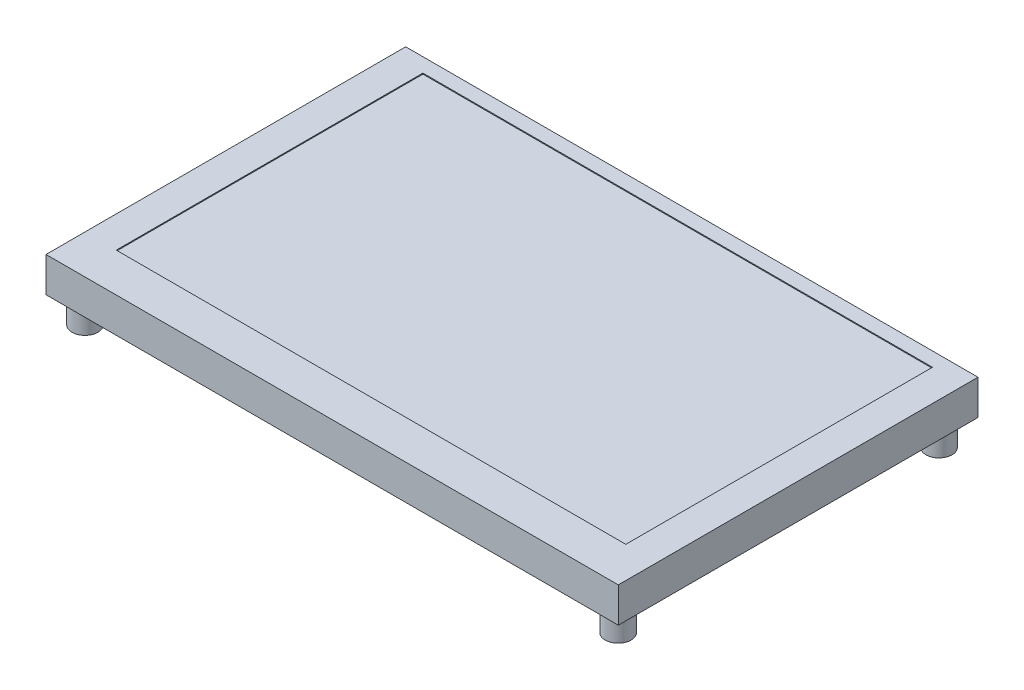
ISO-10303-21;
HEADER;
FILE_DESCRIPTION(('STEP AP214'),'2;1');
FILE_NAME('part.step','',(''),(''),'','','');
FILE_SCHEMA(('AUTOMOTIVE_DESIGN { 1 0 10303 214 1 1 1 1 }'));
ENDSEC;
DATA;
#1=APPLICATION_CONTEXT('core data for automotive mechanical design processes');
#2=APPLICATION_PROTOCOL_DEFINITION('international standard','automotive_design',2000,#1);
#3=PRODUCT_CONTEXT('',#1,'mechanical');
#4=PRODUCT('Part','Part','',(#3));
#5=PRODUCT_RELATED_PRODUCT_CATEGORY('part','',(#4));
#6=PRODUCT_DEFINITION_FORMATION('','',#4);
#7=PRODUCT_DEFINITION_CONTEXT('part definition',#1,'design');
#8=PRODUCT_DEFINITION('design','',#6,#7);
#9=PRODUCT_DEFINITION_SHAPE('','',#8);
#10=(LENGTH_UNIT() NAMED_UNIT(*) SI_UNIT(.MILLI.,.METRE.));
#11=(NAMED_UNIT(*) PLANE_ANGLE_UNIT() SI_UNIT($,.RADIAN.));
#12=(NAMED_UNIT(*) SI_UNIT($,.STERADIAN.) SOLID_ANGLE_UNIT());
#13=UNCERTAINTY_MEASURE_WITH_UNIT(LENGTH_MEASURE(1.E-05),#10,'distance_accuracy_value','');
#14=(GEOMETRIC_REPRESENTATION_CONTEXT(3) GLOBAL_UNCERTAINTY_ASSIGNED_CONTEXT((#13)) GLOBAL_UNIT_ASSIGNED_CONTEXT((#10,
#11,#12)) REPRESENTATION_CONTEXT('',''));
#15=CARTESIAN_POINT('',(0.,0.,0.));
#16=DIRECTION('',(0.,0.,1.));
#17=DIRECTION('',(1.,0.,0.));
#18=AXIS2_PLACEMENT_3D('',#15,#16,#17);
#19=CARTESIAN_POINT('',(0.,0.,0.));
#20=DIRECTION('',(0.,-1.,0.));
#21=DIRECTION('',(0.,0.,-1.));
#22=AXIS2_PLACEMENT_3D('',#19,#20,#21);
#23=PLANE('',#22);
#24=CARTESIAN_POINT('',(-29.35,0.,-24.38));
#25=DIRECTION('',(0.,-1.,0.));
#26=DIRECTION('',(0.,0.,-1.));
#27=AXIS2_PLACEMENT_3D('',#24,#25,#26);
#28=CIRCLE('',#27,2.75);
#29=CARTESIAN_POINT('',(-29.35,0.,-27.13));
#30=VERTEX_POINT('',#29);
#31=EDGE_CURVE('E194',#30,#30,#28,.T.);
#32=ORIENTED_EDGE('',*,*,#31,.F.);
#33=EDGE_LOOP('',(#32));
#34=FACE_BOUND('',#33,.T.);
#35=CARTESIAN_POINT('',(28.65,0.,-24.38));
#36=DIRECTION('',(0.,-1.,0.));
#37=DIRECTION('',(0.,0.,-1.));
#38=AXIS2_PLACEMENT_3D('',#35,#36,#37);
#39=CIRCLE('',#38,2.74999999999999);
#40=CARTESIAN_POINT('',(28.65,0.,-27.13));
#41=VERTEX_POINT('',#40);
#42=EDGE_CURVE('E203',#41,#41,#39,.T.);
#43=ORIENTED_EDGE('',*,*,#42,.F.);
#44=EDGE_LOOP('',(#43));
#45=FACE_BOUND('',#44,.T.);
#46=CARTESIAN_POINT('',(28.65,0.,24.62));
#47=DIRECTION('',(0.,-1.,0.));
#48=DIRECTION('',(0.,0.,-1.));
#49=AXIS2_PLACEMENT_3D('',#46,#47,#48);
#50=CIRCLE('',#49,2.75);
#51=CARTESIAN_POINT('',(28.65,0.,21.87));
#52=VERTEX_POINT('',#51);
#53=EDGE_CURVE('E212',#52,#52,#50,.T.);
#54=ORIENTED_EDGE('',*,*,#53,.F.);
#55=EDGE_LOOP('',(#54));
#56=FACE_BOUND('',#55,.T.);
#57=CARTESIAN_POINT('',(-29.35,0.,24.62));
#58=DIRECTION('',(0.,-1.,0.));
#59=DIRECTION('',(0.,0.,-1.));
#60=AXIS2_PLACEMENT_3D('',#57,#58,#59);
#61=CIRCLE('',#60,2.75);
#62=CARTESIAN_POINT('',(-29.35,0.,21.87));
#63=VERTEX_POINT('',#62);
#64=EDGE_CURVE('E221',#63,#63,#61,.T.);
#65=ORIENTED_EDGE('',*,*,#64,.F.);
#66=EDGE_LOOP('',(#65));
#67=FACE_BOUND('',#66,.T.);
#68=CARTESIAN_POINT('',(-56.5,0.,-34.));
#69=DIRECTION('',(0.,-1.,0.));
#70=DIRECTION('',(0.,0.,-1.));
#71=AXIS2_PLACEMENT_3D('',#68,#69,#70);
#72=CIRCLE('',#71,2.75);
#73=CARTESIAN_POINT('',(-56.5,0.,-36.75));
#74=VERTEX_POINT('',#73);
#75=EDGE_CURVE('E230',#74,#74,#72,.T.);
#76=ORIENTED_EDGE('',*,*,#75,.F.);
#77=EDGE_LOOP('',(#76));
#78=FACE_BOUND('',#77,.T.);
#79=CARTESIAN_POINT('',(56.5,0.,-34.));
#80=DIRECTION('',(0.,-1.,0.));
#81=DIRECTION('',(0.,0.,-1.));
#82=AXIS2_PLACEMENT_3D('',#79,#80,#81);
#83=CIRCLE('',#82,2.75);
#84=CARTESIAN_POINT('',(56.5,0.,-36.75));
#85=VERTEX_POINT('',#84);
#86=EDGE_CURVE('E239',#85,#85,#83,.T.);
#87=ORIENTED_EDGE('',*,*,#86,.F.);
#88=EDGE_LOOP('',(#87));
#89=FACE_BOUND('',#88,.T.);
#90=CARTESIAN_POINT('',(56.5,0.,34.));
#91=DIRECTION('',(0.,-1.,0.));
#92=DIRECTION('',(0.,0.,-1.));
#93=AXIS2_PLACEMENT_3D('',#90,#91,#92);
#94=CIRCLE('',#93,2.75);
#95=CARTESIAN_POINT('',(56.5,0.,31.25));
#96=VERTEX_POINT('',#95);
#97=EDGE_CURVE('E248',#96,#96,#94,.T.);
#98=ORIENTED_EDGE('',*,*,#97,.F.);
#99=EDGE_LOOP('',(#98));
#100=FACE_BOUND('',#99,.T.);
#101=CARTESIAN_POINT('',(-56.5,0.,34.));
#102=DIRECTION('',(0.,-1.,0.));
#103=DIRECTION('',(0.,0.,-1.));
#104=AXIS2_PLACEMENT_3D('',#101,#102,#103);
#105=CIRCLE('',#104,2.75);
#106=CARTESIAN_POINT('',(-56.5,0.,31.25));
#107=VERTEX_POINT('',#106);
#108=EDGE_CURVE('E257',#107,#107,#105,.T.);
#109=ORIENTED_EDGE('',*,*,#108,.F.);
#110=EDGE_LOOP('',(#109));
#111=FACE_BOUND('',#110,.T.);
#112=DIRECTION('',(-1.,0.,0.));
#113=VECTOR('',#112,1.);
#114=CARTESIAN_POINT('',(-60.65,0.,-38.12));
#115=LINE('',#114,#113);
#116=CARTESIAN_POINT('',(-43.65,0.,-38.12));
#117=VERTEX_POINT('',#116);
#118=CARTESIAN_POINT('',(-60.65,0.,-38.12));
#119=VERTEX_POINT('',#118);
#120=EDGE_CURVE('E277',#117,#119,#115,.T.);
#121=ORIENTED_EDGE('',*,*,#120,.F.);
#122=CARTESIAN_POINT('',(-43.65,0.,-30.12));
#123=DIRECTION('',(0.,-1.,0.));
#124=DIRECTION('',(0.,0.,-1.));
#125=AXIS2_PLACEMENT_3D('',#122,#123,#124);
#126=CIRCLE('',#125,8.);
#127=EDGE_CURVE('E57',#117,#117,#126,.T.);
#128=ORIENTED_EDGE('',*,*,#127,.F.);
#129=CARTESIAN_POINT('',(60.65,0.,-38.12));
#130=VERTEX_POINT('',#129);
#131=EDGE_CURVE('E278',#130,#117,#115,.T.);
#132=ORIENTED_EDGE('',*,*,#131,.F.);
#133=DIRECTION('',(0.,0.,-1.));
#134=VECTOR('',#133,1.);
#135=CARTESIAN_POINT('',(60.65,0.,38.12));
#136=LINE('',#135,#134);
#137=CARTESIAN_POINT('',(60.65,0.,38.12));
#138=VERTEX_POINT('',#137);
#139=EDGE_CURVE('E261',#138,#130,#136,.T.);
#140=ORIENTED_EDGE('',*,*,#139,.F.);
#141=DIRECTION('',(1.,0.,0.));
#142=VECTOR('',#141,1.);
#143=CARTESIAN_POINT('',(-60.65,0.,38.12));
#144=LINE('',#143,#142);
#145=CARTESIAN_POINT('',(-60.65,0.,38.12));
#146=VERTEX_POINT('',#145);
#147=EDGE_CURVE('E268',#146,#138,#144,.T.);
#148=ORIENTED_EDGE('',*,*,#147,.F.);
#149=DIRECTION('',(0.,0.,1.));
#150=VECTOR('',#149,1.);
#151=CARTESIAN_POINT('',(-60.65,0.,38.12));
#152=LINE('',#151,#150);
#153=EDGE_CURVE('E281',#119,#146,#152,.T.);
#154=ORIENTED_EDGE('',*,*,#153,.F.);
#155=EDGE_LOOP('',(#121,#128,#132,#140,#148,#154));
#156=FACE_BOUND('',#155,.T.);
#157=DIRECTION('',(-1.,0.,0.));
#158=VECTOR('',#157,1.);
#159=CARTESIAN_POINT('',(-47.65,0.,7.48));
#160=LINE('',#159,#158);
#161=CARTESIAN_POINT('',(-42.65,0.,7.48));
#162=VERTEX_POINT('',#161);
#163=CARTESIAN_POINT('',(-47.65,0.,7.48));
#164=VERTEX_POINT('',#163);
#165=EDGE_CURVE('E463',#162,#164,#160,.T.);
#166=ORIENTED_EDGE('',*,*,#165,.F.);
#167=DIRECTION('',(0.,0.,1.));
#168=VECTOR('',#167,1.);
#169=CARTESIAN_POINT('',(-42.65,0.,-14.52));
#170=LINE('',#169,#168);
#171=CARTESIAN_POINT('',(-42.65,0.,-14.52));
#172=VERTEX_POINT('',#171);
#173=EDGE_CURVE('E150',#172,#162,#170,.T.);
#174=ORIENTED_EDGE('',*,*,#173,.F.);
#175=DIRECTION('',(1.,0.,0.));
#176=VECTOR('',#175,1.);
#177=CARTESIAN_POINT('',(-47.65,0.,-14.52));
#178=LINE('',#177,#176);
#179=CARTESIAN_POINT('',(-47.65,0.,-14.52));
#180=VERTEX_POINT('',#179);
#181=EDGE_CURVE('E146',#180,#172,#178,.T.);
#182=ORIENTED_EDGE('',*,*,#181,.F.);
#183=DIRECTION('',(0.,0.,-1.));
#184=VECTOR('',#183,1.);
#185=CARTESIAN_POINT('',(-47.65,0.,-14.52));
#186=LINE('',#185,#184);
#187=EDGE_CURVE('E465',#164,#180,#186,.T.);
#188=ORIENTED_EDGE('',*,*,#187,.F.);
#189=EDGE_LOOP('',(#166,#174,#182,#188));
#190=FACE_BOUND('',#189,.T.);
#191=ADVANCED_FACE('F36',(#34,#45,#56,#67,#78,#89,#100,#111,#156,#190),#23,.T.);
#192=CARTESIAN_POINT('',(0.,7.4,0.));
#193=DIRECTION('',(0.,-1.,0.));
#194=DIRECTION('',(0.,0.,-1.));
#195=AXIS2_PLACEMENT_3D('',#192,#193,#194);
#196=PLANE('',#195);
#197=DIRECTION('',(0.,0.,-1.));
#198=VECTOR('',#197,1.);
#199=CARTESIAN_POINT('',(60.65,7.4,38.12));
#200=LINE('',#199,#198);
#201=CARTESIAN_POINT('',(60.65,7.4,38.12));
#202=VERTEX_POINT('',#201);
#203=CARTESIAN_POINT('',(60.65,7.4,-38.12));
#204=VERTEX_POINT('',#203);
#205=EDGE_CURVE('E264',#202,#204,#200,.T.);
#206=ORIENTED_EDGE('',*,*,#205,.T.);
#207=DIRECTION('',(-1.,0.,0.));
#208=VECTOR('',#207,1.);
#209=CARTESIAN_POINT('',(-60.65,7.4,-38.12));
#210=LINE('',#209,#208);
#211=CARTESIAN_POINT('',(-60.65,7.4,-38.12));
#212=VERTEX_POINT('',#211);
#213=EDGE_CURVE('E267',#204,#212,#210,.T.);
#214=ORIENTED_EDGE('',*,*,#213,.T.);
#215=DIRECTION('',(0.,0.,1.));
#216=VECTOR('',#215,1.);
#217=CARTESIAN_POINT('',(-60.65,7.4,38.12));
#218=LINE('',#217,#216);
#219=CARTESIAN_POINT('',(-60.65,7.4,38.12));
#220=VERTEX_POINT('',#219);
#221=EDGE_CURVE('E270',#212,#220,#218,.T.);
#222=ORIENTED_EDGE('',*,*,#221,.T.);
#223=DIRECTION('',(1.,0.,0.));
#224=VECTOR('',#223,1.);
#225=CARTESIAN_POINT('',(-60.65,7.4,38.12));
#226=LINE('',#225,#224);
#227=EDGE_CURVE('E272',#220,#202,#226,.T.);
#228=ORIENTED_EDGE('',*,*,#227,.T.);
#229=EDGE_LOOP('',(#206,#214,#222,#228));
#230=FACE_BOUND('',#229,.T.);
#231=DIRECTION('',(1.,0.,0.));
#232=VECTOR('',#231,1.);
#233=CARTESIAN_POINT('',(-54.,7.4,-35.12));
#234=LINE('',#233,#232);
#235=CARTESIAN_POINT('',(-54.,7.4,-35.12));
#236=VERTEX_POINT('',#235);
#237=CARTESIAN_POINT('',(54.,7.4,-35.12));
#238=VERTEX_POINT('',#237);
#239=EDGE_CURVE('E159',#236,#238,#234,.T.);
#240=ORIENTED_EDGE('',*,*,#239,.T.);
#241=DIRECTION('',(0.,0.,-1.));
#242=VECTOR('',#241,1.);
#243=CARTESIAN_POINT('',(54.,7.4,29.88));
#244=LINE('',#243,#242);
#245=CARTESIAN_POINT('',(54.,7.4,29.88));
#246=VERTEX_POINT('',#245);
#247=EDGE_CURVE('E175',#246,#238,#244,.T.);
#248=ORIENTED_EDGE('',*,*,#247,.F.);
#249=DIRECTION('',(1.,0.,0.));
#250=VECTOR('',#249,1.);
#251=CARTESIAN_POINT('',(-54.,7.4,29.88));
#252=LINE('',#251,#250);
#253=CARTESIAN_POINT('',(-54.,7.4,29.88));
#254=VERTEX_POINT('',#253);
#255=EDGE_CURVE('E178',#254,#246,#252,.T.);
#256=ORIENTED_EDGE('',*,*,#255,.F.);
#257=DIRECTION('',(0.,0.,-1.));
#258=VECTOR('',#257,1.);
#259=CARTESIAN_POINT('',(-54.,7.4,29.88));
#260=LINE('',#259,#258);
#261=EDGE_CURVE('E164',#254,#236,#260,.T.);
#262=ORIENTED_EDGE('',*,*,#261,.T.);
#263=EDGE_LOOP('',(#240,#248,#256,#262));
#264=FACE_BOUND('',#263,.T.);
#265=ADVANCED_FACE('F345',(#230,#264),#196,.F.);
#266=CARTESIAN_POINT('',(60.65,7.4,38.12));
#267=DIRECTION('',(-1.,0.,0.));
#268=DIRECTION('',(0.,0.,1.));
#269=AXIS2_PLACEMENT_3D('',#266,#267,#268);
#270=PLANE('',#269);
#271=ORIENTED_EDGE('',*,*,#139,.T.);
#272=DIRECTION('',(0.,-1.,0.));
#273=VECTOR('',#272,1.);
#274=CARTESIAN_POINT('',(60.65,7.4,-38.12));
#275=LINE('',#274,#273);
#276=EDGE_CURVE('E292',#204,#130,#275,.T.);
#277=ORIENTED_EDGE('',*,*,#276,.F.);
#278=ORIENTED_EDGE('',*,*,#205,.F.);
#279=DIRECTION('',(0.,-1.,0.));
#280=VECTOR('',#279,1.);
#281=CARTESIAN_POINT('',(60.65,7.4,38.12));
#282=LINE('',#281,#280);
#283=EDGE_CURVE('E274',#202,#138,#282,.T.);
#284=ORIENTED_EDGE('',*,*,#283,.T.);
#285=EDGE_LOOP('',(#271,#277,#278,#284));
#286=FACE_BOUND('',#285,.T.);
#287=ADVANCED_FACE('F38',(#286),#270,.F.);
#288=CARTESIAN_POINT('',(-60.65,7.4,-38.12));
#289=DIRECTION('',(0.,0.,1.));
#290=DIRECTION('',(1.,0.,0.));
#291=AXIS2_PLACEMENT_3D('',#288,#289,#290);
#292=PLANE('',#291);
#293=ORIENTED_EDGE('',*,*,#131,.T.);
#294=ORIENTED_EDGE('',*,*,#120,.T.);
#295=DIRECTION('',(0.,-1.,0.));
#296=VECTOR('',#295,1.);
#297=CARTESIAN_POINT('',(-60.65,7.4,-38.12));
#298=LINE('',#297,#296);
#299=EDGE_CURVE('E289',#212,#119,#298,.T.);
#300=ORIENTED_EDGE('',*,*,#299,.F.);
#301=ORIENTED_EDGE('',*,*,#213,.F.);
#302=ORIENTED_EDGE('',*,*,#276,.T.);
#303=EDGE_LOOP('',(#293,#294,#300,#301,#302));
#304=FACE_BOUND('',#303,.T.);
#305=ADVANCED_FACE('F698',(#304),#292,.F.);
#306=CARTESIAN_POINT('',(-60.65,7.4,38.12));
#307=DIRECTION('',(1.,0.,0.));
#308=DIRECTION('',(0.,0.,-1.));
#309=AXIS2_PLACEMENT_3D('',#306,#307,#308);
#310=PLANE('',#309);
#311=ORIENTED_EDGE('',*,*,#153,.T.);
#312=DIRECTION('',(0.,-1.,0.));
#313=VECTOR('',#312,1.);
#314=CARTESIAN_POINT('',(-60.65,7.4,38.12));
#315=LINE('',#314,#313);
#316=EDGE_CURVE('E286',#220,#146,#315,.T.);
#317=ORIENTED_EDGE('',*,*,#316,.F.);
#318=ORIENTED_EDGE('',*,*,#221,.F.);
#319=ORIENTED_EDGE('',*,*,#299,.T.);
#320=EDGE_LOOP('',(#311,#317,#318,#319));
#321=FACE_BOUND('',#320,.T.);
#322=ADVANCED_FACE('F687',(#321),#310,.F.);
#323=CARTESIAN_POINT('',(-60.65,7.4,38.12));
#324=DIRECTION('',(0.,0.,-1.));
#325=DIRECTION('',(-1.,0.,0.));
#326=AXIS2_PLACEMENT_3D('',#323,#324,#325);
#327=PLANE('',#326);
#328=ORIENTED_EDGE('',*,*,#147,.T.);
#329=ORIENTED_EDGE('',*,*,#283,.F.);
#330=ORIENTED_EDGE('',*,*,#227,.F.);
#331=ORIENTED_EDGE('',*,*,#316,.T.);
#332=EDGE_LOOP('',(#328,#329,#330,#331));
#333=FACE_BOUND('',#332,.T.);
#334=ADVANCED_FACE('F448',(#333),#327,.F.);
#335=CARTESIAN_POINT('',(-56.5,-5.5,34.));
#336=DIRECTION('',(0.,-1.,0.));
#337=DIRECTION('',(0.,0.,-1.));
#338=AXIS2_PLACEMENT_3D('',#335,#336,#337);
#339=PLANE('',#338);
#340=CARTESIAN_POINT('',(-56.5,-5.5,34.));
#341=DIRECTION('',(0.,-1.,0.));
#342=DIRECTION('',(0.,0.,-1.));
#343=AXIS2_PLACEMENT_3D('',#340,#341,#342);
#344=CIRCLE('',#343,2.75);
#345=CARTESIAN_POINT('',(-56.5,-5.5,31.25));
#346=VERTEX_POINT('',#345);
#347=EDGE_CURVE('E258',#346,#346,#344,.T.);
#348=ORIENTED_EDGE('',*,*,#347,.T.);
#349=EDGE_LOOP('',(#348));
#350=FACE_BOUND('',#349,.T.);
#351=CARTESIAN_POINT('',(-56.5,-5.5,34.));
#352=DIRECTION('',(0.,-1.,0.));
#353=DIRECTION('',(0.,0.,-1.));
#354=AXIS2_PLACEMENT_3D('',#351,#352,#353);
#355=CIRCLE('',#354,1.5);
#356=CARTESIAN_POINT('',(-56.5,-5.5,32.5));
#357=VERTEX_POINT('',#356);
#358=EDGE_CURVE('E252',#357,#357,#355,.T.);
#359=ORIENTED_EDGE('',*,*,#358,.F.);
#360=EDGE_LOOP('',(#359));
#361=FACE_BOUND('',#360,.T.);
#362=ADVANCED_FACE('F445',(#350,#361),#339,.T.);
#363=CARTESIAN_POINT('',(-56.5,-5.5,34.));
#364=DIRECTION('',(0.,1.,0.));
#365=DIRECTION('',(0.,0.,1.));
#366=AXIS2_PLACEMENT_3D('',#363,#364,#365);
#367=CYLINDRICAL_SURFACE('',#366,2.75);
#368=ORIENTED_EDGE('',*,*,#347,.F.);
#369=EDGE_LOOP('',(#368));
#370=FACE_BOUND('',#369,.T.);
#371=ORIENTED_EDGE('',*,*,#108,.T.);
#372=EDGE_LOOP('',(#371));
#373=FACE_BOUND('',#372,.T.);
#374=ADVANCED_FACE('F366',(#370,#373),#367,.T.);
#375=CARTESIAN_POINT('',(-56.5,-5.5,34.));
#376=DIRECTION('',(0.,1.,0.));
#377=DIRECTION('',(0.,0.,1.));
#378=AXIS2_PLACEMENT_3D('',#375,#376,#377);
#379=CYLINDRICAL_SURFACE('',#378,1.5);
#380=ORIENTED_EDGE('',*,*,#358,.T.);
#381=EDGE_LOOP('',(#380));
#382=FACE_BOUND('',#381,.T.);
#383=CARTESIAN_POINT('',(-56.5,0.,34.));
#384=DIRECTION('',(0.,-1.,0.));
#385=DIRECTION('',(0.,0.,-1.));
#386=AXIS2_PLACEMENT_3D('',#383,#384,#385);
#387=CIRCLE('',#386,1.5);
#388=CARTESIAN_POINT('',(-56.5,0.,32.5));
#389=VERTEX_POINT('',#388);
#390=EDGE_CURVE('E295',#389,#389,#387,.F.);
#391=ORIENTED_EDGE('',*,*,#390,.T.);
#392=EDGE_LOOP('',(#391));
#393=FACE_BOUND('',#392,.T.);
#394=ADVANCED_FACE('F356',(#382,#393),#379,.F.);
#395=ORIENTED_EDGE('',*,*,#390,.F.);
#396=EDGE_LOOP('',(#395));
#397=FACE_BOUND('',#396,.T.);
#398=ADVANCED_FACE('F347',(#397),#23,.T.);
#399=CARTESIAN_POINT('',(56.5,-5.5,34.));
#400=DIRECTION('',(0.,-1.,0.));
#401=DIRECTION('',(0.,0.,-1.));
#402=AXIS2_PLACEMENT_3D('',#399,#400,#401);
#403=PLANE('',#402);
#404=CARTESIAN_POINT('',(56.5,-5.5,34.));
#405=DIRECTION('',(0.,-1.,0.));
#406=DIRECTION('',(0.,0.,-1.));
#407=AXIS2_PLACEMENT_3D('',#404,#405,#406);
#408=CIRCLE('',#407,2.75);
#409=CARTESIAN_POINT('',(56.5,-5.5,31.25));
#410=VERTEX_POINT('',#409);
#411=EDGE_CURVE('E249',#410,#410,#408,.T.);
#412=ORIENTED_EDGE('',*,*,#411,.T.);
#413=EDGE_LOOP('',(#412));
#414=FACE_BOUND('',#413,.T.);
#415=CARTESIAN_POINT('',(56.5,-5.5,34.));
#416=DIRECTION('',(0.,-1.,0.));
#417=DIRECTION('',(0.,0.,-1.));
#418=AXIS2_PLACEMENT_3D('',#415,#416,#417);
#419=CIRCLE('',#418,1.5);
#420=CARTESIAN_POINT('',(56.5,-5.5,32.5));
#421=VERTEX_POINT('',#420);
#422=EDGE_CURVE('E243',#421,#421,#419,.T.);
#423=ORIENTED_EDGE('',*,*,#422,.F.);
#424=EDGE_LOOP('',(#423));
#425=FACE_BOUND('',#424,.T.);
#426=ADVANCED_FACE('F355',(#414,#425),#403,.T.);
#427=CARTESIAN_POINT('',(56.5,-5.5,34.));
#428=DIRECTION('',(0.,1.,0.));
#429=DIRECTION('',(0.,0.,1.));
#430=AXIS2_PLACEMENT_3D('',#427,#428,#429);
#431=CYLINDRICAL_SURFACE('',#430,2.75);
#432=ORIENTED_EDGE('',*,*,#411,.F.);
#433=EDGE_LOOP('',(#432));
#434=FACE_BOUND('',#433,.T.);
#435=ORIENTED_EDGE('',*,*,#97,.T.);
#436=EDGE_LOOP('',(#435));
#437=FACE_BOUND('',#436,.T.);
#438=ADVANCED_FACE('F363',(#434,#437),#431,.T.);
#439=CARTESIAN_POINT('',(56.5,-5.5,34.));
#440=DIRECTION('',(0.,1.,0.));
#441=DIRECTION('',(0.,0.,1.));
#442=AXIS2_PLACEMENT_3D('',#439,#440,#441);
#443=CYLINDRICAL_SURFACE('',#442,1.5);
#444=ORIENTED_EDGE('',*,*,#422,.T.);
#445=EDGE_LOOP('',(#444));
#446=FACE_BOUND('',#445,.T.);
#447=CARTESIAN_POINT('',(56.5,0.,34.));
#448=DIRECTION('',(0.,-1.,0.));
#449=DIRECTION('',(0.,0.,-1.));
#450=AXIS2_PLACEMENT_3D('',#447,#448,#449);
#451=CIRCLE('',#450,1.5);
#452=CARTESIAN_POINT('',(56.5,0.,32.5));
#453=VERTEX_POINT('',#452);
#454=EDGE_CURVE('E298',#453,#453,#451,.F.);
#455=ORIENTED_EDGE('',*,*,#454,.T.);
#456=EDGE_LOOP('',(#455));
#457=FACE_BOUND('',#456,.T.);
#458=ADVANCED_FACE('F372',(#446,#457),#443,.F.);
#459=ORIENTED_EDGE('',*,*,#454,.F.);
#460=EDGE_LOOP('',(#459));
#461=FACE_BOUND('',#460,.T.);
#462=ADVANCED_FACE('F358',(#461),#23,.T.);
#463=CARTESIAN_POINT('',(56.5,-5.5,-34.));
#464=DIRECTION('',(0.,-1.,0.));
#465=DIRECTION('',(0.,0.,-1.));
#466=AXIS2_PLACEMENT_3D('',#463,#464,#465);
#467=PLANE('',#466);
#468=CARTESIAN_POINT('',(56.5,-5.5,-34.));
#469=DIRECTION('',(0.,-1.,0.));
#470=DIRECTION('',(0.,0.,-1.));
#471=AXIS2_PLACEMENT_3D('',#468,#469,#470);
#472=CIRCLE('',#471,2.75);
#473=CARTESIAN_POINT('',(56.5,-5.5,-36.75));
#474=VERTEX_POINT('',#473);
#475=EDGE_CURVE('E240',#474,#474,#472,.T.);
#476=ORIENTED_EDGE('',*,*,#475,.T.);
#477=EDGE_LOOP('',(#476));
#478=FACE_BOUND('',#477,.T.);
#479=CARTESIAN_POINT('',(56.5,-5.5,-34.));
#480=DIRECTION('',(0.,-1.,0.));
#481=DIRECTION('',(0.,0.,-1.));
#482=AXIS2_PLACEMENT_3D('',#479,#480,#481);
#483=CIRCLE('',#482,1.5);
#484=CARTESIAN_POINT('',(56.5,-5.5,-35.5));
#485=VERTEX_POINT('',#484);
#486=EDGE_CURVE('E234',#485,#485,#483,.T.);
#487=ORIENTED_EDGE('',*,*,#486,.F.);
#488=EDGE_LOOP('',(#487));
#489=FACE_BOUND('',#488,.T.);
#490=ADVANCED_FACE('F371',(#478,#489),#467,.T.);
#491=CARTESIAN_POINT('',(56.5,-5.5,-34.));
#492=DIRECTION('',(0.,1.,0.));
#493=DIRECTION('',(0.,0.,1.));
#494=AXIS2_PLACEMENT_3D('',#491,#492,#493);
#495=CYLINDRICAL_SURFACE('',#494,2.75);
#496=ORIENTED_EDGE('',*,*,#475,.F.);
#497=EDGE_LOOP('',(#496));
#498=FACE_BOUND('',#497,.T.);
#499=ORIENTED_EDGE('',*,*,#86,.T.);
#500=EDGE_LOOP('',(#499));
#501=FACE_BOUND('',#500,.T.);
#502=ADVANCED_FACE('F379',(#498,#501),#495,.T.);
#503=CARTESIAN_POINT('',(56.5,-5.5,-34.));
#504=DIRECTION('',(0.,1.,0.));
#505=DIRECTION('',(0.,0.,1.));
#506=AXIS2_PLACEMENT_3D('',#503,#504,#505);
#507=CYLINDRICAL_SURFACE('',#506,1.5);
#508=ORIENTED_EDGE('',*,*,#486,.T.);
#509=EDGE_LOOP('',(#508));
#510=FACE_BOUND('',#509,.T.);
#511=CARTESIAN_POINT('',(56.5,0.,-34.));
#512=DIRECTION('',(0.,-1.,0.));
#513=DIRECTION('',(0.,0.,-1.));
#514=AXIS2_PLACEMENT_3D('',#511,#512,#513);
#515=CIRCLE('',#514,1.5);
#516=CARTESIAN_POINT('',(56.5,0.,-35.5));
#517=VERTEX_POINT('',#516);
#518=EDGE_CURVE('E301',#517,#517,#515,.F.);
#519=ORIENTED_EDGE('',*,*,#518,.T.);
#520=EDGE_LOOP('',(#519));
#521=FACE_BOUND('',#520,.T.);
#522=ADVANCED_FACE('F387',(#510,#521),#507,.F.);
#523=ORIENTED_EDGE('',*,*,#518,.F.);
#524=EDGE_LOOP('',(#523));
#525=FACE_BOUND('',#524,.T.);
#526=ADVANCED_FACE('F374',(#525),#23,.T.);
#527=CARTESIAN_POINT('',(-56.5,-5.5,-34.));
#528=DIRECTION('',(0.,-1.,0.));
#529=DIRECTION('',(0.,0.,-1.));
#530=AXIS2_PLACEMENT_3D('',#527,#528,#529);
#531=PLANE('',#530);
#532=CARTESIAN_POINT('',(-56.5,-5.5,-34.));
#533=DIRECTION('',(0.,-1.,0.));
#534=DIRECTION('',(0.,0.,-1.));
#535=AXIS2_PLACEMENT_3D('',#532,#533,#534);
#536=CIRCLE('',#535,2.75);
#537=CARTESIAN_POINT('',(-56.5,-5.5,-36.75));
#538=VERTEX_POINT('',#537);
#539=EDGE_CURVE('E231',#538,#538,#536,.T.);
#540=ORIENTED_EDGE('',*,*,#539,.T.);
#541=EDGE_LOOP('',(#540));
#542=FACE_BOUND('',#541,.T.);
#543=CARTESIAN_POINT('',(-56.5,-5.5,-34.));
#544=DIRECTION('',(0.,-1.,0.));
#545=DIRECTION('',(0.,0.,-1.));
#546=AXIS2_PLACEMENT_3D('',#543,#544,#545);
#547=CIRCLE('',#546,1.5);
#548=CARTESIAN_POINT('',(-56.5,-5.5,-35.5));
#549=VERTEX_POINT('',#548);
#550=EDGE_CURVE('E225',#549,#549,#547,.T.);
#551=ORIENTED_EDGE('',*,*,#550,.F.);
#552=EDGE_LOOP('',(#551));
#553=FACE_BOUND('',#552,.T.);
#554=ADVANCED_FACE('F386',(#542,#553),#531,.T.);
#555=CARTESIAN_POINT('',(-56.5,-5.5,-34.));
#556=DIRECTION('',(0.,1.,0.));
#557=DIRECTION('',(0.,0.,1.));
#558=AXIS2_PLACEMENT_3D('',#555,#556,#557);
#559=CYLINDRICAL_SURFACE('',#558,2.75);
#560=ORIENTED_EDGE('',*,*,#539,.F.);
#561=EDGE_LOOP('',(#560));
#562=FACE_BOUND('',#561,.T.);
#563=ORIENTED_EDGE('',*,*,#75,.T.);
#564=EDGE_LOOP('',(#563));
#565=FACE_BOUND('',#564,.T.);
#566=ADVANCED_FACE('F394',(#562,#565),#559,.T.);
#567=CARTESIAN_POINT('',(-56.5,-5.5,-34.));
#568=DIRECTION('',(0.,1.,0.));
#569=DIRECTION('',(0.,0.,1.));
#570=AXIS2_PLACEMENT_3D('',#567,#568,#569);
#571=CYLINDRICAL_SURFACE('',#570,1.5);
#572=ORIENTED_EDGE('',*,*,#550,.T.);
#573=EDGE_LOOP('',(#572));
#574=FACE_BOUND('',#573,.T.);
#575=CARTESIAN_POINT('',(-56.5,0.,-34.));
#576=DIRECTION('',(0.,-1.,0.));
#577=DIRECTION('',(0.,0.,-1.));
#578=AXIS2_PLACEMENT_3D('',#575,#576,#577);
#579=CIRCLE('',#578,1.5);
#580=CARTESIAN_POINT('',(-56.5,0.,-35.5));
#581=VERTEX_POINT('',#580);
#582=EDGE_CURVE('E304',#581,#581,#579,.F.);
#583=ORIENTED_EDGE('',*,*,#582,.T.);
#584=EDGE_LOOP('',(#583));
#585=FACE_BOUND('',#584,.T.);
#586=ADVANCED_FACE('F402',(#574,#585),#571,.F.);
#587=ORIENTED_EDGE('',*,*,#582,.F.);
#588=EDGE_LOOP('',(#587));
#589=FACE_BOUND('',#588,.T.);
#590=ADVANCED_FACE('F389',(#589),#23,.T.);
#591=CARTESIAN_POINT('',(-29.35,-5.3,24.62));
#592=DIRECTION('',(0.,-1.,0.));
#593=DIRECTION('',(0.,0.,-1.));
#594=AXIS2_PLACEMENT_3D('',#591,#592,#593);
#595=PLANE('',#594);
#596=CARTESIAN_POINT('',(-29.35,-5.3,24.62));
#597=DIRECTION('',(0.,-1.,0.));
#598=DIRECTION('',(0.,0.,-1.));
#599=AXIS2_PLACEMENT_3D('',#596,#597,#598);
#600=CIRCLE('',#599,2.75);
#601=CARTESIAN_POINT('',(-29.35,-5.3,21.87));
#602=VERTEX_POINT('',#601);
#603=EDGE_CURVE('E222',#602,#602,#600,.T.);
#604=ORIENTED_EDGE('',*,*,#603,.T.);
#605=EDGE_LOOP('',(#604));
#606=FACE_BOUND('',#605,.T.);
#607=CARTESIAN_POINT('',(-29.35,-5.3,24.62));
#608=DIRECTION('',(0.,-1.,0.));
#609=DIRECTION('',(0.,0.,-1.));
#610=AXIS2_PLACEMENT_3D('',#607,#608,#609);
#611=CIRCLE('',#610,1.5);
#612=CARTESIAN_POINT('',(-29.35,-5.3,23.12));
#613=VERTEX_POINT('',#612);
#614=EDGE_CURVE('E216',#613,#613,#611,.T.);
#615=ORIENTED_EDGE('',*,*,#614,.F.);
#616=EDGE_LOOP('',(#615));
#617=FACE_BOUND('',#616,.T.);
#618=ADVANCED_FACE('F401',(#606,#617),#595,.T.);
#619=CARTESIAN_POINT('',(-29.35,-5.3,24.62));
#620=DIRECTION('',(0.,1.,0.));
#621=DIRECTION('',(0.,0.,1.));
#622=AXIS2_PLACEMENT_3D('',#619,#620,#621);
#623=CYLINDRICAL_SURFACE('',#622,2.75);
#624=ORIENTED_EDGE('',*,*,#603,.F.);
#625=EDGE_LOOP('',(#624));
#626=FACE_BOUND('',#625,.T.);
#627=ORIENTED_EDGE('',*,*,#64,.T.);
#628=EDGE_LOOP('',(#627));
#629=FACE_BOUND('',#628,.T.);
#630=ADVANCED_FACE('F408',(#626,#629),#623,.T.);
#631=CARTESIAN_POINT('',(-29.35,-5.3,24.62));
#632=DIRECTION('',(0.,1.,0.));
#633=DIRECTION('',(0.,0.,1.));
#634=AXIS2_PLACEMENT_3D('',#631,#632,#633);
#635=CYLINDRICAL_SURFACE('',#634,1.5);
#636=ORIENTED_EDGE('',*,*,#614,.T.);
#637=EDGE_LOOP('',(#636));
#638=FACE_BOUND('',#637,.T.);
#639=CARTESIAN_POINT('',(-29.35,0.,24.62));
#640=DIRECTION('',(0.,-1.,0.));
#641=DIRECTION('',(0.,0.,-1.));
#642=AXIS2_PLACEMENT_3D('',#639,#640,#641);
#643=CIRCLE('',#642,1.5);
#644=CARTESIAN_POINT('',(-29.35,0.,23.12));
#645=VERTEX_POINT('',#644);
#646=EDGE_CURVE('E307',#645,#645,#643,.F.);
#647=ORIENTED_EDGE('',*,*,#646,.T.);
#648=EDGE_LOOP('',(#647));
#649=FACE_BOUND('',#648,.T.);
#650=ADVANCED_FACE('F416',(#638,#649),#635,.F.);
#651=ORIENTED_EDGE('',*,*,#646,.F.);
#652=EDGE_LOOP('',(#651));
#653=FACE_BOUND('',#652,.T.);
#654=ADVANCED_FACE('F339',(#653),#23,.T.);
#655=CARTESIAN_POINT('',(28.65,-5.3,24.62));
#656=DIRECTION('',(0.,-1.,0.));
#657=DIRECTION('',(0.,0.,-1.));
#658=AXIS2_PLACEMENT_3D('',#655,#656,#657);
#659=PLANE('',#658);
#660=CARTESIAN_POINT('',(28.65,-5.3,24.62));
#661=DIRECTION('',(0.,-1.,0.));
#662=DIRECTION('',(0.,0.,-1.));
#663=AXIS2_PLACEMENT_3D('',#660,#661,#662);
#664=CIRCLE('',#663,2.75);
#665=CARTESIAN_POINT('',(28.65,-5.3,21.87));
#666=VERTEX_POINT('',#665);
#667=EDGE_CURVE('E213',#666,#666,#664,.T.);
#668=ORIENTED_EDGE('',*,*,#667,.T.);
#669=EDGE_LOOP('',(#668));
#670=FACE_BOUND('',#669,.T.);
#671=CARTESIAN_POINT('',(28.65,-5.3,24.62));
#672=DIRECTION('',(0.,-1.,0.));
#673=DIRECTION('',(0.,0.,-1.));
#674=AXIS2_PLACEMENT_3D('',#671,#672,#673);
#675=CIRCLE('',#674,1.5);
#676=CARTESIAN_POINT('',(28.65,-5.3,23.12));
#677=VERTEX_POINT('',#676);
#678=EDGE_CURVE('E207',#677,#677,#675,.T.);
#679=ORIENTED_EDGE('',*,*,#678,.F.);
#680=EDGE_LOOP('',(#679));
#681=FACE_BOUND('',#680,.T.);
#682=ADVANCED_FACE('F415',(#670,#681),#659,.T.);
#683=CARTESIAN_POINT('',(28.65,-5.3,24.62));
#684=DIRECTION('',(0.,1.,0.));
#685=DIRECTION('',(0.,0.,1.));
#686=AXIS2_PLACEMENT_3D('',#683,#684,#685);
#687=CYLINDRICAL_SURFACE('',#686,2.75);
#688=ORIENTED_EDGE('',*,*,#667,.F.);
#689=EDGE_LOOP('',(#688));
#690=FACE_BOUND('',#689,.T.);
#691=ORIENTED_EDGE('',*,*,#53,.T.);
#692=EDGE_LOOP('',(#691));
#693=FACE_BOUND('',#692,.T.);
#694=ADVANCED_FACE('F422',(#690,#693),#687,.T.);
#695=CARTESIAN_POINT('',(28.65,-5.3,24.62));
#696=DIRECTION('',(0.,1.,0.));
#697=DIRECTION('',(0.,0.,1.));
#698=AXIS2_PLACEMENT_3D('',#695,#696,#697);
#699=CYLINDRICAL_SURFACE('',#698,1.5);
#700=ORIENTED_EDGE('',*,*,#678,.T.);
#701=EDGE_LOOP('',(#700));
#702=FACE_BOUND('',#701,.T.);
#703=CARTESIAN_POINT('',(28.65,0.,24.62));
#704=DIRECTION('',(0.,-1.,0.));
#705=DIRECTION('',(0.,0.,-1.));
#706=AXIS2_PLACEMENT_3D('',#703,#704,#705);
#707=CIRCLE('',#706,1.5);
#708=CARTESIAN_POINT('',(28.65,0.,23.12));
#709=VERTEX_POINT('',#708);
#710=EDGE_CURVE('E310',#709,#709,#707,.F.);
#711=ORIENTED_EDGE('',*,*,#710,.T.);
#712=EDGE_LOOP('',(#711));
#713=FACE_BOUND('',#712,.T.);
#714=ADVANCED_FACE('F337',(#702,#713),#699,.F.);
#715=ORIENTED_EDGE('',*,*,#710,.F.);
#716=EDGE_LOOP('',(#715));
#717=FACE_BOUND('',#716,.T.);
#718=ADVANCED_FACE('F321',(#717),#23,.T.);
#719=CARTESIAN_POINT('',(28.65,-5.3,-24.38));
#720=DIRECTION('',(0.,-1.,0.));
#721=DIRECTION('',(0.,0.,-1.));
#722=AXIS2_PLACEMENT_3D('',#719,#720,#721);
#723=PLANE('',#722);
#724=CARTESIAN_POINT('',(28.65,-5.3,-24.38));
#725=DIRECTION('',(0.,-1.,0.));
#726=DIRECTION('',(0.,0.,-1.));
#727=AXIS2_PLACEMENT_3D('',#724,#725,#726);
#728=CIRCLE('',#727,2.74999999999999);
#729=CARTESIAN_POINT('',(28.65,-5.3,-27.13));
#730=VERTEX_POINT('',#729);
#731=EDGE_CURVE('E204',#730,#730,#728,.T.);
#732=ORIENTED_EDGE('',*,*,#731,.T.);
#733=EDGE_LOOP('',(#732));
#734=FACE_BOUND('',#733,.T.);
#735=CARTESIAN_POINT('',(28.65,-5.3,-24.38));
#736=DIRECTION('',(0.,-1.,0.));
#737=DIRECTION('',(0.,0.,-1.));
#738=AXIS2_PLACEMENT_3D('',#735,#736,#737);
#739=CIRCLE('',#738,1.50000000000001);
#740=CARTESIAN_POINT('',(28.65,-5.3,-25.88));
#741=VERTEX_POINT('',#740);
#742=EDGE_CURVE('E198',#741,#741,#739,.T.);
#743=ORIENTED_EDGE('',*,*,#742,.F.);
#744=EDGE_LOOP('',(#743));
#745=FACE_BOUND('',#744,.T.);
#746=ADVANCED_FACE('F336',(#734,#745),#723,.T.);
#747=CARTESIAN_POINT('',(28.65,-5.3,-24.38));
#748=DIRECTION('',(0.,1.,0.));
#749=DIRECTION('',(0.,0.,1.));
#750=AXIS2_PLACEMENT_3D('',#747,#748,#749);
#751=CYLINDRICAL_SURFACE('',#750,2.74999999999999);
#752=ORIENTED_EDGE('',*,*,#731,.F.);
#753=EDGE_LOOP('',(#752));
#754=FACE_BOUND('',#753,.T.);
#755=ORIENTED_EDGE('',*,*,#42,.T.);
#756=EDGE_LOOP('',(#755));
#757=FACE_BOUND('',#756,.T.);
#758=ADVANCED_FACE('F330',(#754,#757),#751,.T.);
#759=CARTESIAN_POINT('',(28.65,-5.3,-24.38));
#760=DIRECTION('',(0.,1.,0.));
#761=DIRECTION('',(0.,0.,1.));
#762=AXIS2_PLACEMENT_3D('',#759,#760,#761);
#763=CYLINDRICAL_SURFACE('',#762,1.50000000000001);
#764=ORIENTED_EDGE('',*,*,#742,.T.);
#765=EDGE_LOOP('',(#764));
#766=FACE_BOUND('',#765,.T.);
#767=CARTESIAN_POINT('',(28.65,0.,-24.38));
#768=DIRECTION('',(0.,-1.,0.));
#769=DIRECTION('',(0.,0.,-1.));
#770=AXIS2_PLACEMENT_3D('',#767,#768,#769);
#771=CIRCLE('',#770,1.50000000000001);
#772=CARTESIAN_POINT('',(28.65,0.,-25.88));
#773=VERTEX_POINT('',#772);
#774=EDGE_CURVE('E44',#773,#773,#771,.F.);
#775=ORIENTED_EDGE('',*,*,#774,.T.);
#776=EDGE_LOOP('',(#775));
#777=FACE_BOUND('',#776,.T.);
#778=ADVANCED_FACE('F315',(#766,#777),#763,.F.);
#779=ORIENTED_EDGE('',*,*,#774,.F.);
#780=EDGE_LOOP('',(#779));
#781=FACE_BOUND('',#780,.T.);
#782=ADVANCED_FACE('F317',(#781),#23,.T.);
#783=CARTESIAN_POINT('',(-29.35,-5.3,-24.38));
#784=DIRECTION('',(0.,-1.,0.));
#785=DIRECTION('',(0.,0.,-1.));
#786=AXIS2_PLACEMENT_3D('',#783,#784,#785);
#787=PLANE('',#786);
#788=CARTESIAN_POINT('',(-29.35,-5.3,-24.38));
#789=DIRECTION('',(0.,-1.,0.));
#790=DIRECTION('',(0.,0.,-1.));
#791=AXIS2_PLACEMENT_3D('',#788,#789,#790);
#792=CIRCLE('',#791,2.75);
#793=CARTESIAN_POINT('',(-29.35,-5.3,-27.13));
#794=VERTEX_POINT('',#793);
#795=EDGE_CURVE('E195',#794,#794,#792,.T.);
#796=ORIENTED_EDGE('',*,*,#795,.T.);
#797=EDGE_LOOP('',(#796));
#798=FACE_BOUND('',#797,.T.);
#799=CARTESIAN_POINT('',(-29.35,-5.3,-24.38));
#800=DIRECTION('',(0.,-1.,0.));
#801=DIRECTION('',(0.,0.,-1.));
#802=AXIS2_PLACEMENT_3D('',#799,#800,#801);
#803=CIRCLE('',#802,1.5);
#804=CARTESIAN_POINT('',(-29.35,-5.3,-25.88));
#805=VERTEX_POINT('',#804);
#806=EDGE_CURVE('E191',#805,#805,#803,.T.);
#807=ORIENTED_EDGE('',*,*,#806,.F.);
#808=EDGE_LOOP('',(#807));
#809=FACE_BOUND('',#808,.T.);
#810=ADVANCED_FACE('F319',(#798,#809),#787,.T.);
#811=CARTESIAN_POINT('',(-29.35,-5.3,-24.38));
#812=DIRECTION('',(0.,1.,0.));
#813=DIRECTION('',(0.,0.,1.));
#814=AXIS2_PLACEMENT_3D('',#811,#812,#813);
#815=CYLINDRICAL_SURFACE('',#814,2.75);
#816=ORIENTED_EDGE('',*,*,#795,.F.);
#817=EDGE_LOOP('',(#816));
#818=FACE_BOUND('',#817,.T.);
#819=ORIENTED_EDGE('',*,*,#31,.T.);
#820=EDGE_LOOP('',(#819));
#821=FACE_BOUND('',#820,.T.);
#822=ADVANCED_FACE('F327',(#818,#821),#815,.T.);
#823=CARTESIAN_POINT('',(-29.35,-5.3,-24.38));
#824=DIRECTION('',(0.,1.,0.));
#825=DIRECTION('',(0.,0.,1.));
#826=AXIS2_PLACEMENT_3D('',#823,#824,#825);
#827=CYLINDRICAL_SURFACE('',#826,1.5);
#828=ORIENTED_EDGE('',*,*,#806,.T.);
#829=EDGE_LOOP('',(#828));
#830=FACE_BOUND('',#829,.T.);
#831=CARTESIAN_POINT('',(-29.35,0.,-24.38));
#832=DIRECTION('',(0.,-1.,0.));
#833=DIRECTION('',(0.,0.,-1.));
#834=AXIS2_PLACEMENT_3D('',#831,#832,#833);
#835=CIRCLE('',#834,1.5);
#836=CARTESIAN_POINT('',(-29.35,0.,-25.88));
#837=VERTEX_POINT('',#836);
#838=EDGE_CURVE('E11',#837,#837,#835,.F.);
#839=ORIENTED_EDGE('',*,*,#838,.T.);
#840=EDGE_LOOP('',(#839));
#841=FACE_BOUND('',#840,.T.);
#842=ADVANCED_FACE('F342',(#830,#841),#827,.F.);
#843=ORIENTED_EDGE('',*,*,#838,.F.);
#844=EDGE_LOOP('',(#843));
#845=FACE_BOUND('',#844,.T.);
#846=ADVANCED_FACE('F322',(#845),#23,.T.);
#847=CARTESIAN_POINT('',(-54.,7.2,-35.12));
#848=DIRECTION('',(0.,0.,1.));
#849=DIRECTION('',(1.,0.,0.));
#850=AXIS2_PLACEMENT_3D('',#847,#848,#849);
#851=PLANE('',#850);
#852=ORIENTED_EDGE('',*,*,#239,.F.);
#853=DIRECTION('',(0.,1.,0.));
#854=VECTOR('',#853,1.);
#855=CARTESIAN_POINT('',(-54.,7.2,-35.12));
#856=LINE('',#855,#854);
#857=CARTESIAN_POINT('',(-54.,7.2,-35.12));
#858=VERTEX_POINT('',#857);
#859=EDGE_CURVE('E172',#858,#236,#856,.T.);
#860=ORIENTED_EDGE('',*,*,#859,.F.);
#861=DIRECTION('',(1.,0.,0.));
#862=VECTOR('',#861,1.);
#863=CARTESIAN_POINT('',(-54.,7.2,-35.12));
#864=LINE('',#863,#862);
#865=CARTESIAN_POINT('',(54.,7.2,-35.12));
#866=VERTEX_POINT('',#865);
#867=EDGE_CURVE('E161',#858,#866,#864,.T.);
#868=ORIENTED_EDGE('',*,*,#867,.T.);
#869=DIRECTION('',(0.,1.,0.));
#870=VECTOR('',#869,1.);
#871=CARTESIAN_POINT('',(54.,7.2,-35.12));
#872=LINE('',#871,#870);
#873=EDGE_CURVE('E189',#866,#238,#872,.T.);
#874=ORIENTED_EDGE('',*,*,#873,.T.);
#875=EDGE_LOOP('',(#852,#860,#868,#874));
#876=FACE_BOUND('',#875,.T.);
#877=ADVANCED_FACE('F341',(#876),#851,.T.);
#878=CARTESIAN_POINT('',(54.,7.2,29.88));
#879=DIRECTION('',(1.,0.,0.));
#880=DIRECTION('',(0.,0.,-1.));
#881=AXIS2_PLACEMENT_3D('',#878,#879,#880);
#882=PLANE('',#881);
#883=ORIENTED_EDGE('',*,*,#247,.T.);
#884=ORIENTED_EDGE('',*,*,#873,.F.);
#885=DIRECTION('',(0.,0.,-1.));
#886=VECTOR('',#885,1.);
#887=CARTESIAN_POINT('',(54.,7.2,29.88));
#888=LINE('',#887,#886);
#889=CARTESIAN_POINT('',(54.,7.2,29.88));
#890=VERTEX_POINT('',#889);
#891=EDGE_CURVE('E163',#890,#866,#888,.T.);
#892=ORIENTED_EDGE('',*,*,#891,.F.);
#893=DIRECTION('',(0.,1.,0.));
#894=VECTOR('',#893,1.);
#895=CARTESIAN_POINT('',(54.,7.2,29.88));
#896=LINE('',#895,#894);
#897=EDGE_CURVE('E187',#890,#246,#896,.T.);
#898=ORIENTED_EDGE('',*,*,#897,.T.);
#899=EDGE_LOOP('',(#883,#884,#892,#898));
#900=FACE_BOUND('',#899,.T.);
#901=ADVANCED_FACE('F509',(#900),#882,.F.);
#902=CARTESIAN_POINT('',(-54.,7.2,29.88));
#903=DIRECTION('',(0.,0.,1.));
#904=DIRECTION('',(1.,0.,0.));
#905=AXIS2_PLACEMENT_3D('',#902,#903,#904);
#906=PLANE('',#905);
#907=ORIENTED_EDGE('',*,*,#255,.T.);
#908=ORIENTED_EDGE('',*,*,#897,.F.);
#909=DIRECTION('',(1.,0.,0.));
#910=VECTOR('',#909,1.);
#911=CARTESIAN_POINT('',(-54.,7.2,29.88));
#912=LINE('',#911,#910);
#913=CARTESIAN_POINT('',(-54.,7.2,29.88));
#914=VERTEX_POINT('',#913);
#915=EDGE_CURVE('E167',#914,#890,#912,.T.);
#916=ORIENTED_EDGE('',*,*,#915,.F.);
#917=DIRECTION('',(0.,1.,0.));
#918=VECTOR('',#917,1.);
#919=CARTESIAN_POINT('',(-54.,7.2,29.88));
#920=LINE('',#919,#918);
#921=EDGE_CURVE('E185',#914,#254,#920,.T.);
#922=ORIENTED_EDGE('',*,*,#921,.T.);
#923=EDGE_LOOP('',(#907,#908,#916,#922));
#924=FACE_BOUND('',#923,.T.);
#925=ADVANCED_FACE('F505',(#924),#906,.F.);
#926=CARTESIAN_POINT('',(-54.,7.2,29.88));
#927=DIRECTION('',(1.,0.,0.));
#928=DIRECTION('',(0.,0.,-1.));
#929=AXIS2_PLACEMENT_3D('',#926,#927,#928);
#930=PLANE('',#929);
#931=ORIENTED_EDGE('',*,*,#261,.F.);
#932=ORIENTED_EDGE('',*,*,#921,.F.);
#933=DIRECTION('',(0.,0.,-1.));
#934=VECTOR('',#933,1.);
#935=CARTESIAN_POINT('',(-54.,7.2,29.88));
#936=LINE('',#935,#934);
#937=EDGE_CURVE('E170',#914,#858,#936,.T.);
#938=ORIENTED_EDGE('',*,*,#937,.T.);
#939=ORIENTED_EDGE('',*,*,#859,.T.);
#940=EDGE_LOOP('',(#931,#932,#938,#939));
#941=FACE_BOUND('',#940,.T.);
#942=ADVANCED_FACE('F501',(#941),#930,.T.);
#943=CARTESIAN_POINT('',(0.,7.2,0.));
#944=DIRECTION('',(0.,1.,0.));
#945=DIRECTION('',(0.,0.,1.));
#946=AXIS2_PLACEMENT_3D('',#943,#944,#945);
#947=PLANE('',#946);
#948=ORIENTED_EDGE('',*,*,#867,.F.);
#949=ORIENTED_EDGE('',*,*,#937,.F.);
#950=ORIENTED_EDGE('',*,*,#915,.T.);
#951=ORIENTED_EDGE('',*,*,#891,.T.);
#952=EDGE_LOOP('',(#948,#949,#950,#951));
#953=FACE_BOUND('',#952,.T.);
#954=ADVANCED_FACE('F497',(#953),#947,.T.);
#955=CARTESIAN_POINT('',(-43.65,-4.,-30.12));
#956=DIRECTION('',(0.,1.,0.));
#957=DIRECTION('',(0.,0.,1.));
#958=AXIS2_PLACEMENT_3D('',#955,#956,#957);
#959=CYLINDRICAL_SURFACE('',#958,8.);
#960=CARTESIAN_POINT('',(-43.65,-4.,-30.12));
#961=DIRECTION('',(0.,-1.,0.));
#962=DIRECTION('',(0.,0.,-1.));
#963=AXIS2_PLACEMENT_3D('',#960,#961,#962);
#964=CIRCLE('',#963,8.);
#965=CARTESIAN_POINT('',(-43.65,-4.,-38.12));
#966=VERTEX_POINT('',#965);
#967=EDGE_CURVE('E153',#966,#966,#964,.T.);
#968=ORIENTED_EDGE('',*,*,#967,.F.);
#969=EDGE_LOOP('',(#968));
#970=FACE_BOUND('',#969,.T.);
#971=ORIENTED_EDGE('',*,*,#127,.T.);
#972=EDGE_LOOP('',(#971));
#973=FACE_BOUND('',#972,.T.);
#974=ADVANCED_FACE('F493',(#970,#973),#959,.T.);
#975=CARTESIAN_POINT('',(-43.65,-4.,-30.12));
#976=DIRECTION('',(0.,-1.,0.));
#977=DIRECTION('',(0.,0.,-1.));
#978=AXIS2_PLACEMENT_3D('',#975,#976,#977);
#979=PLANE('',#978);
#980=ORIENTED_EDGE('',*,*,#967,.T.);
#981=EDGE_LOOP('',(#980));
#982=FACE_BOUND('',#981,.T.);
#983=ADVANCED_FACE('F490',(#982),#979,.T.);
#984=CARTESIAN_POINT('',(-42.65,-3.,-14.52));
#985=DIRECTION('',(-1.,0.,0.));
#986=DIRECTION('',(0.,0.,1.));
#987=AXIS2_PLACEMENT_3D('',#984,#985,#986);
#988=PLANE('',#987);
#989=ORIENTED_EDGE('',*,*,#173,.T.);
#990=DIRECTION('',(0.,1.,0.));
#991=VECTOR('',#990,1.);
#992=CARTESIAN_POINT('',(-42.65,-3.,7.48));
#993=LINE('',#992,#991);
#994=CARTESIAN_POINT('',(-42.65,-3.,7.48));
#995=VERTEX_POINT('',#994);
#996=EDGE_CURVE('E131',#995,#162,#993,.T.);
#997=ORIENTED_EDGE('',*,*,#996,.F.);
#998=DIRECTION('',(0.,0.,1.));
#999=VECTOR('',#998,1.);
#1000=CARTESIAN_POINT('',(-42.65,-3.,-14.52));
#1001=LINE('',#1000,#999);
#1002=CARTESIAN_POINT('',(-42.65,-3.,-14.52));
#1003=VERTEX_POINT('',#1002);
#1004=EDGE_CURVE('E138',#1003,#995,#1001,.T.);
#1005=ORIENTED_EDGE('',*,*,#1004,.F.);
#1006=DIRECTION('',(0.,1.,0.));
#1007=VECTOR('',#1006,1.);
#1008=CARTESIAN_POINT('',(-42.65,-3.,-14.52));
#1009=LINE('',#1008,#1007);
#1010=EDGE_CURVE('E472',#1003,#172,#1009,.T.);
#1011=ORIENTED_EDGE('',*,*,#1010,.T.);
#1012=EDGE_LOOP('',(#989,#997,#1005,#1011));
#1013=FACE_BOUND('',#1012,.T.);
#1014=ADVANCED_FACE('F148',(#1013),#988,.F.);
#1015=CARTESIAN_POINT('',(-47.65,-3.,7.48));
#1016=DIRECTION('',(0.,0.,-1.));
#1017=DIRECTION('',(-1.,0.,0.));
#1018=AXIS2_PLACEMENT_3D('',#1015,#1016,#1017);
#1019=PLANE('',#1018);
#1020=ORIENTED_EDGE('',*,*,#165,.T.);
#1021=DIRECTION('',(0.,1.,0.));
#1022=VECTOR('',#1021,1.);
#1023=CARTESIAN_POINT('',(-47.65,-3.,7.48));
#1024=LINE('',#1023,#1022);
#1025=CARTESIAN_POINT('',(-47.65,-3.,7.48));
#1026=VERTEX_POINT('',#1025);
#1027=EDGE_CURVE('E134',#1026,#164,#1024,.T.);
#1028=ORIENTED_EDGE('',*,*,#1027,.F.);
#1029=DIRECTION('',(-1.,0.,0.));
#1030=VECTOR('',#1029,1.);
#1031=CARTESIAN_POINT('',(-47.65,-3.,7.48));
#1032=LINE('',#1031,#1030);
#1033=EDGE_CURVE('E127',#995,#1026,#1032,.T.);
#1034=ORIENTED_EDGE('',*,*,#1033,.F.);
#1035=ORIENTED_EDGE('',*,*,#996,.T.);
#1036=EDGE_LOOP('',(#1020,#1028,#1034,#1035));
#1037=FACE_BOUND('',#1036,.T.);
#1038=ADVANCED_FACE('F129',(#1037),#1019,.F.);
#1039=CARTESIAN_POINT('',(-47.65,-3.,-14.52));
#1040=DIRECTION('',(1.,0.,0.));
#1041=DIRECTION('',(0.,0.,-1.));
#1042=AXIS2_PLACEMENT_3D('',#1039,#1040,#1041);
#1043=PLANE('',#1042);
#1044=ORIENTED_EDGE('',*,*,#187,.T.);
#1045=DIRECTION('',(0.,1.,0.));
#1046=VECTOR('',#1045,1.);
#1047=CARTESIAN_POINT('',(-47.65,-3.,-14.52));
#1048=LINE('',#1047,#1046);
#1049=CARTESIAN_POINT('',(-47.65,-3.,-14.52));
#1050=VERTEX_POINT('',#1049);
#1051=EDGE_CURVE('E51',#1050,#180,#1048,.T.);
#1052=ORIENTED_EDGE('',*,*,#1051,.F.);
#1053=DIRECTION('',(0.,0.,-1.));
#1054=VECTOR('',#1053,1.);
#1055=CARTESIAN_POINT('',(-47.65,-3.,-14.52));
#1056=LINE('',#1055,#1054);
#1057=EDGE_CURVE('E137',#1026,#1050,#1056,.T.);
#1058=ORIENTED_EDGE('',*,*,#1057,.F.);
#1059=ORIENTED_EDGE('',*,*,#1027,.T.);
#1060=EDGE_LOOP('',(#1044,#1052,#1058,#1059));
#1061=FACE_BOUND('',#1060,.T.);
#1062=ADVANCED_FACE('F475',(#1061),#1043,.F.);
#1063=CARTESIAN_POINT('',(-47.65,-3.,-14.52));
#1064=DIRECTION('',(0.,0.,1.));
#1065=DIRECTION('',(1.,0.,0.));
#1066=AXIS2_PLACEMENT_3D('',#1063,#1064,#1065);
#1067=PLANE('',#1066);
#1068=ORIENTED_EDGE('',*,*,#181,.T.);
#1069=ORIENTED_EDGE('',*,*,#1010,.F.);
#1070=DIRECTION('',(1.,0.,0.));
#1071=VECTOR('',#1070,1.);
#1072=CARTESIAN_POINT('',(-47.65,-3.,-14.52));
#1073=LINE('',#1072,#1071);
#1074=EDGE_CURVE('E142',#1050,#1003,#1073,.T.);
#1075=ORIENTED_EDGE('',*,*,#1074,.F.);
#1076=ORIENTED_EDGE('',*,*,#1051,.T.);
#1077=EDGE_LOOP('',(#1068,#1069,#1075,#1076));
#1078=FACE_BOUND('',#1077,.T.);
#1079=ADVANCED_FACE('F476',(#1078),#1067,.F.);
#1080=CARTESIAN_POINT('',(0.,-3.,0.));
#1081=DIRECTION('',(0.,1.,0.));
#1082=DIRECTION('',(0.,0.,1.));
#1083=AXIS2_PLACEMENT_3D('',#1080,#1081,#1082);
#1084=PLANE('',#1083);
#1085=ORIENTED_EDGE('',*,*,#1004,.T.);
#1086=ORIENTED_EDGE('',*,*,#1033,.T.);
#1087=ORIENTED_EDGE('',*,*,#1057,.T.);
#1088=ORIENTED_EDGE('',*,*,#1074,.T.);
#1089=EDGE_LOOP('',(#1085,#1086,#1087,#1088));
#1090=FACE_BOUND('',#1089,.T.);
#1091=ADVANCED_FACE('F141',(#1090),#1084,.F.);
#1092=CLOSED_SHELL('',(#191,#265,#287,#305,#322,#334,#362,#374,#394,#398,#426,#438,#458,#462,
#490,#502,#522,#526,#554,#566,#586,#590,#618,#630,#650,#654,#682,#694,#714,#718,#746,#758,#778,
#782,#810,#822,#842,#846,#877,#901,#925,#942,#954,#974,#983,#1014,#1038,#1062,#1079,#1091));
#1093=MANIFOLD_SOLID_BREP('B2',#1092);
#1094=ADVANCED_BREP_SHAPE_REPRESENTATION('',(#18,#1093),#14);
#1095=SHAPE_DEFINITION_REPRESENTATION(#9,#1094);
ENDSEC;
END-ISO-10303-21;
